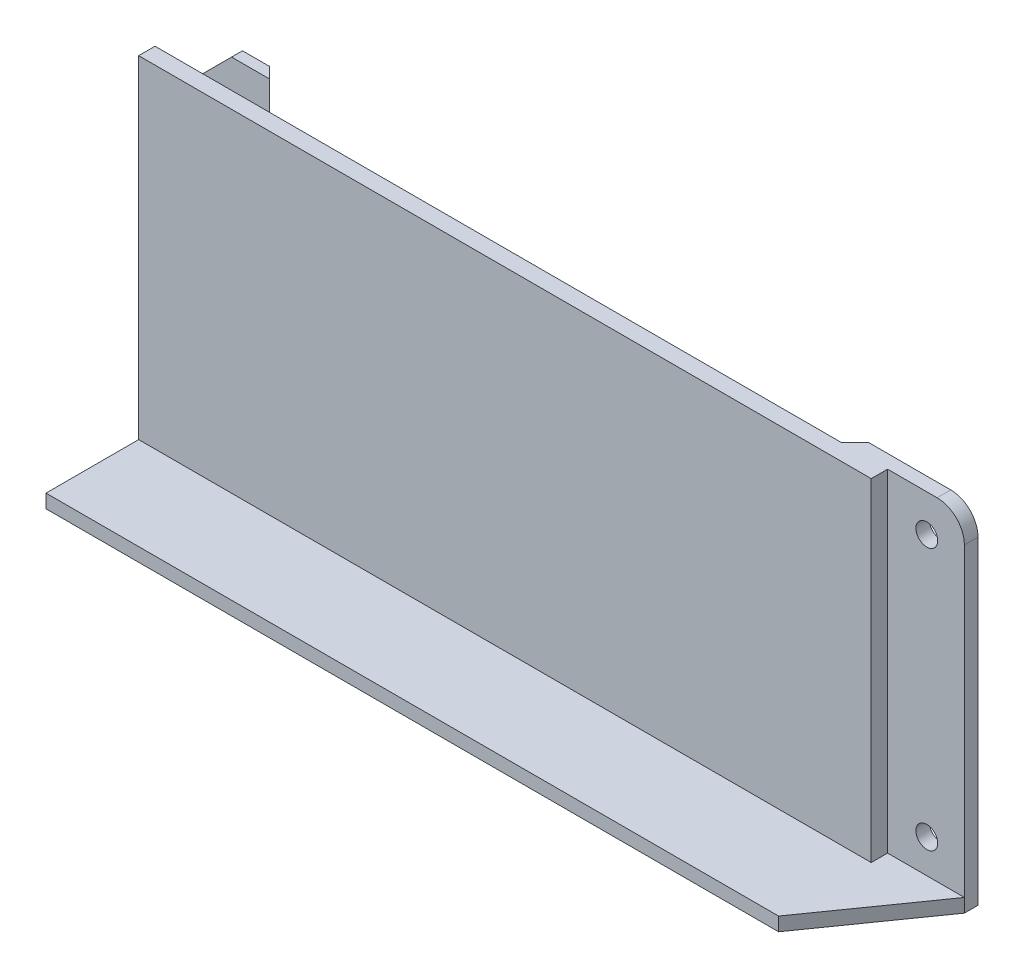
ISO-10303-21;
HEADER;
FILE_DESCRIPTION(('STEP AP214'),'2;1');
FILE_NAME('part.step','',(''),(''),'','','');
FILE_SCHEMA(('AUTOMOTIVE_DESIGN { 1 0 10303 214 1 1 1 1 }'));
ENDSEC;
DATA;
#1=APPLICATION_CONTEXT('core data for automotive mechanical design processes');
#2=APPLICATION_PROTOCOL_DEFINITION('international standard','automotive_design',2000,#1);
#3=PRODUCT_CONTEXT('',#1,'mechanical');
#4=PRODUCT('Part','Part','',(#3));
#5=PRODUCT_RELATED_PRODUCT_CATEGORY('part','',(#4));
#6=PRODUCT_DEFINITION_FORMATION('','',#4);
#7=PRODUCT_DEFINITION_CONTEXT('part definition',#1,'design');
#8=PRODUCT_DEFINITION('design','',#6,#7);
#9=PRODUCT_DEFINITION_SHAPE('','',#8);
#10=(LENGTH_UNIT() NAMED_UNIT(*) SI_UNIT(.MILLI.,.METRE.));
#11=(NAMED_UNIT(*) PLANE_ANGLE_UNIT() SI_UNIT($,.RADIAN.));
#12=(NAMED_UNIT(*) SI_UNIT($,.STERADIAN.) SOLID_ANGLE_UNIT());
#13=UNCERTAINTY_MEASURE_WITH_UNIT(LENGTH_MEASURE(1.E-05),#10,'distance_accuracy_value','');
#14=(GEOMETRIC_REPRESENTATION_CONTEXT(3) GLOBAL_UNCERTAINTY_ASSIGNED_CONTEXT((#13)) GLOBAL_UNIT_ASSIGNED_CONTEXT((#10,
#11,#12)) REPRESENTATION_CONTEXT('',''));
#15=CARTESIAN_POINT('',(0.,0.,0.));
#16=DIRECTION('',(0.,0.,1.));
#17=DIRECTION('',(1.,0.,0.));
#18=AXIS2_PLACEMENT_3D('',#15,#16,#17);
#19=CARTESIAN_POINT('',(480.344700758442,-19.2281954829413,21.));
#20=DIRECTION('',(-0.707106781186541,0.,0.707106781186554));
#21=DIRECTION('',(0.,1.,0.));
#22=AXIS2_PLACEMENT_3D('',#19,#20,#21);
#23=PLANE('',#22);
#24=DIRECTION('',(0.,1.,0.));
#25=VECTOR('',#24,1.);
#26=CARTESIAN_POINT('',(481.344700758442,-22.637593977255,22.));
#27=LINE('',#26,#25);
#28=CARTESIAN_POINT('',(481.344700758442,-22.637593977255,22.));
#29=VERTEX_POINT('',#28);
#30=CARTESIAN_POINT('',(481.344700758442,-14.3,22.));
#31=VERTEX_POINT('',#30);
#32=EDGE_CURVE('E308',#29,#31,#27,.T.);
#33=ORIENTED_EDGE('',*,*,#32,.F.);
#34=DIRECTION('',(0.577350269189632,-0.577350269189623,0.577350269189622));
#35=VECTOR('',#34,1.);
#36=CARTESIAN_POINT('',(479.344700758442,-20.637593977255,20.));
#37=LINE('',#36,#35);
#38=CARTESIAN_POINT('',(479.344700758442,-20.637593977255,20.));
#39=VERTEX_POINT('',#38);
#40=EDGE_CURVE('E11',#39,#29,#37,.T.);
#41=ORIENTED_EDGE('',*,*,#40,.F.);
#42=DIRECTION('',(0.,-1.,0.));
#43=VECTOR('',#42,1.);
#44=CARTESIAN_POINT('',(479.344700758442,-19.2281954829413,20.));
#45=LINE('',#44,#43);
#46=CARTESIAN_POINT('',(479.344700758442,-9.,20.));
#47=VERTEX_POINT('',#46);
#48=EDGE_CURVE('E311',#47,#39,#45,.T.);
#49=ORIENTED_EDGE('',*,*,#48,.F.);
#50=DIRECTION('',(-0.707106781186554,0.,-0.707106781186541));
#51=VECTOR('',#50,1.);
#52=CARTESIAN_POINT('',(480.844700758442,-9.,21.5));
#53=LINE('',#52,#51);
#54=CARTESIAN_POINT('',(481.344700758442,-9.,22.));
#55=VERTEX_POINT('',#54);
#56=EDGE_CURVE('E278',#55,#47,#53,.T.);
#57=ORIENTED_EDGE('',*,*,#56,.F.);
#58=DIRECTION('',(0.,1.,0.));
#59=VECTOR('',#58,1.);
#60=CARTESIAN_POINT('',(481.344700758442,-22.637593977255,22.));
#61=LINE('',#60,#59);
#62=EDGE_CURVE('E220',#31,#55,#61,.T.);
#63=ORIENTED_EDGE('',*,*,#62,.F.);
#64=EDGE_LOOP('',(#33,#41,#49,#57,#63));
#65=FACE_BOUND('',#64,.T.);
#66=ADVANCED_FACE('F17',(#65),#23,.F.);
#67=CARTESIAN_POINT('',(465.8665052755,-21.637593977255,21.));
#68=DIRECTION('',(0.,0.707106781186547,0.707106781186548));
#69=DIRECTION('',(1.,0.,0.));
#70=AXIS2_PLACEMENT_3D('',#67,#68,#69);
#71=PLANE('',#70);
#72=DIRECTION('',(-1.,0.,0.));
#73=VECTOR('',#72,1.);
#74=CARTESIAN_POINT('',(465.8665052755,-20.637593977255,20.));
#75=LINE('',#74,#73);
#76=CARTESIAN_POINT('',(462.707106781187,-20.637593977255,20.));
#77=VERTEX_POINT('',#76);
#78=EDGE_CURVE('E328',#39,#77,#75,.T.);
#79=ORIENTED_EDGE('',*,*,#78,.F.);
#80=ORIENTED_EDGE('',*,*,#40,.T.);
#81=DIRECTION('',(1.,0.,0.));
#82=VECTOR('',#81,1.);
#83=CARTESIAN_POINT('',(460.707106781187,-22.637593977255,22.));
#84=LINE('',#83,#82);
#85=CARTESIAN_POINT('',(460.707106781187,-22.637593977255,22.));
#86=VERTEX_POINT('',#85);
#87=EDGE_CURVE('E189',#86,#29,#84,.T.);
#88=ORIENTED_EDGE('',*,*,#87,.F.);
#89=DIRECTION('',(-0.57735026918962,-0.57735026918963,0.577350269189627));
#90=VECTOR('',#89,1.);
#91=CARTESIAN_POINT('',(466.446204522657,-16.8984962357844,16.2609022585293));
#92=LINE('',#91,#90);
#93=EDGE_CURVE('E27',#77,#86,#92,.T.);
#94=ORIENTED_EDGE('',*,*,#93,.F.);
#95=EDGE_LOOP('',(#79,#80,#88,#94));
#96=FACE_BOUND('',#95,.T.);
#97=ADVANCED_FACE('F613',(#96),#71,.F.);
#98=CARTESIAN_POINT('',(474.344700758442,-9.,22.));
#99=DIRECTION('',(0.707106781186553,-0.707106781186542,0.));
#100=DIRECTION('',(0.,0.,-1.));
#101=AXIS2_PLACEMENT_3D('',#98,#99,#100);
#102=PLANE('',#101);
#103=ORIENTED_EDGE('',*,*,#93,.T.);
#104=DIRECTION('',(-0.707106781186542,-0.707106781186553,0.));
#105=VECTOR('',#104,1.);
#106=CARTESIAN_POINT('',(474.344700758442,-9.,22.));
#107=LINE('',#106,#105);
#108=CARTESIAN_POINT('',(469.044700758442,-14.3,22.));
#109=VERTEX_POINT('',#108);
#110=EDGE_CURVE('E179',#109,#86,#107,.T.);
#111=ORIENTED_EDGE('',*,*,#110,.F.);
#112=DIRECTION('',(-0.707106781186542,-0.707106781186553,0.));
#113=VECTOR('',#112,1.);
#114=CARTESIAN_POINT('',(474.344700758442,-9.,22.));
#115=LINE('',#114,#113);
#116=CARTESIAN_POINT('',(474.344700758442,-9.,22.));
#117=VERTEX_POINT('',#116);
#118=EDGE_CURVE('E184',#117,#109,#115,.T.);
#119=ORIENTED_EDGE('',*,*,#118,.F.);
#120=DIRECTION('',(0.,0.,-1.));
#121=VECTOR('',#120,1.);
#122=CARTESIAN_POINT('',(474.344700758442,-9.,22.));
#123=LINE('',#122,#121);
#124=CARTESIAN_POINT('',(474.344700758442,-9.,20.));
#125=VERTEX_POINT('',#124);
#126=EDGE_CURVE('E295',#117,#125,#123,.T.);
#127=ORIENTED_EDGE('',*,*,#126,.T.);
#128=DIRECTION('',(-0.707106781186542,-0.707106781186553,0.));
#129=VECTOR('',#128,1.);
#130=CARTESIAN_POINT('',(474.344700758442,-9.,20.));
#131=LINE('',#130,#129);
#132=EDGE_CURVE('E315',#125,#77,#131,.T.);
#133=ORIENTED_EDGE('',*,*,#132,.T.);
#134=EDGE_LOOP('',(#103,#111,#119,#127,#133));
#135=FACE_BOUND('',#134,.T.);
#136=ADVANCED_FACE('F181',(#135),#102,.F.);
#137=CARTESIAN_POINT('',(471.025903769814,-15.8187969886275,20.));
#138=DIRECTION('',(0.,0.,1.));
#139=DIRECTION('',(0.,-1.,0.));
#140=AXIS2_PLACEMENT_3D('',#137,#138,#139);
#141=PLANE('',#140);
#142=ORIENTED_EDGE('',*,*,#78,.T.);
#143=ORIENTED_EDGE('',*,*,#132,.F.);
#144=DIRECTION('',(-1.,0.,0.));
#145=VECTOR('',#144,1.);
#146=CARTESIAN_POINT('',(473.637593977255,-9.,20.));
#147=LINE('',#146,#145);
#148=EDGE_CURVE('E291',#47,#125,#147,.T.);
#149=ORIENTED_EDGE('',*,*,#148,.F.);
#150=ORIENTED_EDGE('',*,*,#48,.T.);
#151=EDGE_LOOP('',(#142,#143,#149,#150));
#152=FACE_BOUND('',#151,.T.);
#153=ADVANCED_FACE('F646',(#152),#141,.F.);
#154=CARTESIAN_POINT('',(481.344700758442,-9.,22.));
#155=DIRECTION('',(0.,-1.,0.));
#156=DIRECTION('',(-1.,0.,0.));
#157=AXIS2_PLACEMENT_3D('',#154,#155,#156);
#158=PLANE('',#157);
#159=ORIENTED_EDGE('',*,*,#56,.T.);
#160=ORIENTED_EDGE('',*,*,#148,.T.);
#161=ORIENTED_EDGE('',*,*,#126,.F.);
#162=DIRECTION('',(1.,0.,0.));
#163=VECTOR('',#162,1.);
#164=CARTESIAN_POINT('',(473.637593977255,-9.,22.));
#165=LINE('',#164,#163);
#166=EDGE_CURVE('E20',#117,#55,#165,.T.);
#167=ORIENTED_EDGE('',*,*,#166,.T.);
#168=EDGE_LOOP('',(#159,#160,#161,#167));
#169=FACE_BOUND('',#168,.T.);
#170=ADVANCED_FACE('F626',(#169),#158,.F.);
#171=CARTESIAN_POINT('',(601.742836560724,-46.05,22.));
#172=DIRECTION('',(0.,0.,1.));
#173=DIRECTION('',(0.,-1.,0.));
#174=AXIS2_PLACEMENT_3D('',#171,#172,#173);
#175=PLANE('',#174);
#176=CARTESIAN_POINT('',(601.892836560724,-69.1365481775718,22.));
#177=DIRECTION('',(0.,0.,1.));
#178=DIRECTION('',(1.,0.,0.));
#179=AXIS2_PLACEMENT_3D('',#176,#177,#178);
#180=CIRCLE('',#179,2.);
#181=CARTESIAN_POINT('',(599.892836560724,-69.1365481775718,22.));
#182=VERTEX_POINT('',#181);
#183=EDGE_CURVE('E255',#182,#182,#180,.T.);
#184=ORIENTED_EDGE('',*,*,#183,.F.);
#185=EDGE_LOOP('',(#184));
#186=FACE_BOUND('',#185,.T.);
#187=CARTESIAN_POINT('',(601.892836560724,-21.0770595104522,22.));
#188=DIRECTION('',(0.,0.,1.));
#189=DIRECTION('',(1.,0.,0.));
#190=AXIS2_PLACEMENT_3D('',#187,#188,#189);
#191=CIRCLE('',#190,2.);
#192=CARTESIAN_POINT('',(599.892836560724,-21.0770595104522,22.));
#193=VERTEX_POINT('',#192);
#194=EDGE_CURVE('E332',#193,#193,#191,.T.);
#195=ORIENTED_EDGE('',*,*,#194,.F.);
#196=EDGE_LOOP('',(#195));
#197=FACE_BOUND('',#196,.T.);
#198=CARTESIAN_POINT('',(603.785673121448,-19.3,22.));
#199=DIRECTION('',(0.,0.,1.));
#200=DIRECTION('',(0.707106781186549,0.707106781186546,0.));
#201=AXIS2_PLACEMENT_3D('',#198,#199,#200);
#202=CIRCLE('',#201,5.);
#203=CARTESIAN_POINT('',(608.785673121448,-19.3,22.));
#204=VERTEX_POINT('',#203);
#205=CARTESIAN_POINT('',(603.785673121448,-14.3,22.));
#206=VERTEX_POINT('',#205);
#207=EDGE_CURVE('E256',#204,#206,#202,.T.);
#208=ORIENTED_EDGE('',*,*,#207,.T.);
#209=DIRECTION('',(-1.,0.,0.));
#210=VECTOR('',#209,1.);
#211=CARTESIAN_POINT('',(608.785673121448,-14.3,22.));
#212=LINE('',#211,#210);
#213=CARTESIAN_POINT('',(594.7,-14.3,22.));
#214=VERTEX_POINT('',#213);
#215=EDGE_CURVE('E268',#206,#214,#212,.T.);
#216=ORIENTED_EDGE('',*,*,#215,.T.);
#217=DIRECTION('',(0.,1.,0.));
#218=VECTOR('',#217,1.);
#219=CARTESIAN_POINT('',(594.7,-77.8,22.));
#220=LINE('',#219,#218);
#221=CARTESIAN_POINT('',(594.7,-75.3,22.));
#222=VERTEX_POINT('',#221);
#223=EDGE_CURVE('E251',#222,#214,#220,.T.);
#224=ORIENTED_EDGE('',*,*,#223,.F.);
#225=DIRECTION('',(-1.,0.,0.));
#226=VECTOR('',#225,1.);
#227=CARTESIAN_POINT('',(601.742836560724,-75.3,22.));
#228=LINE('',#227,#226);
#229=CARTESIAN_POINT('',(608.785673121448,-75.3,22.));
#230=VERTEX_POINT('',#229);
#231=EDGE_CURVE('E279',#230,#222,#228,.T.);
#232=ORIENTED_EDGE('',*,*,#231,.F.);
#233=DIRECTION('',(0.,1.,0.));
#234=VECTOR('',#233,1.);
#235=CARTESIAN_POINT('',(608.785673121448,-77.8,22.));
#236=LINE('',#235,#234);
#237=EDGE_CURVE('E250',#230,#204,#236,.T.);
#238=ORIENTED_EDGE('',*,*,#237,.T.);
#239=EDGE_LOOP('',(#208,#216,#224,#232,#238));
#240=FACE_BOUND('',#239,.T.);
#241=ADVANCED_FACE('F583',(#186,#197,#240),#175,.T.);
#242=CARTESIAN_POINT('',(608.785673121448,-77.8,22.));
#243=DIRECTION('',(-1.,0.,0.));
#244=DIRECTION('',(0.,0.,1.));
#245=AXIS2_PLACEMENT_3D('',#242,#243,#244);
#246=PLANE('',#245);
#247=DIRECTION('',(0.,0.,1.));
#248=VECTOR('',#247,1.);
#249=CARTESIAN_POINT('',(608.785673121448,-19.3,22.));
#250=LINE('',#249,#248);
#251=CARTESIAN_POINT('',(608.785673121448,-19.3,19.5));
#252=VERTEX_POINT('',#251);
#253=EDGE_CURVE('E260',#252,#204,#250,.T.);
#254=ORIENTED_EDGE('',*,*,#253,.T.);
#255=ORIENTED_EDGE('',*,*,#237,.F.);
#256=DIRECTION('',(0.,1.,0.));
#257=VECTOR('',#256,1.);
#258=CARTESIAN_POINT('',(608.785673121448,-77.8,22.));
#259=LINE('',#258,#257);
#260=CARTESIAN_POINT('',(608.785673121448,-77.8,22.));
#261=VERTEX_POINT('',#260);
#262=EDGE_CURVE('E246',#261,#230,#259,.T.);
#263=ORIENTED_EDGE('',*,*,#262,.F.);
#264=DIRECTION('',(0.,0.,-1.));
#265=VECTOR('',#264,1.);
#266=CARTESIAN_POINT('',(608.785673121448,-77.8,22.));
#267=LINE('',#266,#265);
#268=CARTESIAN_POINT('',(608.785673121448,-77.8,19.5));
#269=VERTEX_POINT('',#268);
#270=EDGE_CURVE('E244',#261,#269,#267,.T.);
#271=ORIENTED_EDGE('',*,*,#270,.T.);
#272=DIRECTION('',(0.,1.,0.));
#273=VECTOR('',#272,1.);
#274=CARTESIAN_POINT('',(608.785673121448,-77.8,19.5));
#275=LINE('',#274,#273);
#276=EDGE_CURVE('E212',#269,#252,#275,.T.);
#277=ORIENTED_EDGE('',*,*,#276,.T.);
#278=EDGE_LOOP('',(#254,#255,#263,#271,#277));
#279=FACE_BOUND('',#278,.T.);
#280=ADVANCED_FACE('F578',(#279),#246,.F.);
#281=CARTESIAN_POINT('',(608.785673121448,-77.8,22.));
#282=DIRECTION('',(-0.817583198432766,0.,-0.575810484135578));
#283=DIRECTION('',(-0.575810484135578,0.,0.817583198432766));
#284=AXIS2_PLACEMENT_3D('',#281,#282,#283);
#285=PLANE('',#284);
#286=DIRECTION('',(-0.575810484135578,0.,0.817583198432766));
#287=VECTOR('',#286,1.);
#288=CARTESIAN_POINT('',(608.785673121448,-77.8,22.));
#289=LINE('',#288,#287);
#290=CARTESIAN_POINT('',(594.7,-77.8,42.));
#291=VERTEX_POINT('',#290);
#292=EDGE_CURVE('E240',#261,#291,#289,.T.);
#293=ORIENTED_EDGE('',*,*,#292,.F.);
#294=ORIENTED_EDGE('',*,*,#262,.T.);
#295=DIRECTION('',(-0.575810484135578,0.,0.817583198432766));
#296=VECTOR('',#295,1.);
#297=CARTESIAN_POINT('',(608.785673121448,-75.3,22.));
#298=LINE('',#297,#296);
#299=CARTESIAN_POINT('',(594.7,-75.3,42.));
#300=VERTEX_POINT('',#299);
#301=EDGE_CURVE('E283',#230,#300,#298,.T.);
#302=ORIENTED_EDGE('',*,*,#301,.T.);
#303=DIRECTION('',(0.,-1.,0.));
#304=VECTOR('',#303,1.);
#305=CARTESIAN_POINT('',(594.7,-61.925,42.0000000000007));
#306=LINE('',#305,#304);
#307=EDGE_CURVE('E300',#300,#291,#306,.T.);
#308=ORIENTED_EDGE('',*,*,#307,.T.);
#309=EDGE_LOOP('',(#293,#294,#302,#308));
#310=FACE_BOUND('',#309,.T.);
#311=ADVANCED_FACE('F573',(#310),#285,.F.);
#312=CARTESIAN_POINT('',(587.45,-14.3,20.75));
#313=DIRECTION('',(0.707106781186563,0.,0.707106781186532));
#314=DIRECTION('',(0.,-1.,0.));
#315=AXIS2_PLACEMENT_3D('',#312,#313,#314);
#316=PLANE('',#315);
#317=DIRECTION('',(0.707106781186532,0.,-0.707106781186563));
#318=VECTOR('',#317,1.);
#319=CARTESIAN_POINT('',(588.95,-77.8,19.25));
#320=LINE('',#319,#318);
#321=CARTESIAN_POINT('',(586.2,-77.8,22.));
#322=VERTEX_POINT('',#321);
#323=CARTESIAN_POINT('',(588.7,-77.8,19.5));
#324=VERTEX_POINT('',#323);
#325=EDGE_CURVE('E165',#322,#324,#320,.T.);
#326=ORIENTED_EDGE('',*,*,#325,.F.);
#327=DIRECTION('',(0.,-1.,0.));
#328=VECTOR('',#327,1.);
#329=CARTESIAN_POINT('',(586.2,-14.3,22.));
#330=LINE('',#329,#328);
#331=CARTESIAN_POINT('',(586.2,-14.3,22.));
#332=VERTEX_POINT('',#331);
#333=EDGE_CURVE('E307',#332,#322,#330,.T.);
#334=ORIENTED_EDGE('',*,*,#333,.F.);
#335=DIRECTION('',(-0.707106781186532,0.,0.707106781186563));
#336=VECTOR('',#335,1.);
#337=CARTESIAN_POINT('',(592.471418280362,-14.3,15.7285817196381));
#338=LINE('',#337,#336);
#339=CARTESIAN_POINT('',(588.7,-14.3,19.5));
#340=VERTEX_POINT('',#339);
#341=EDGE_CURVE('E150',#340,#332,#338,.T.);
#342=ORIENTED_EDGE('',*,*,#341,.F.);
#343=DIRECTION('',(0.,1.,0.));
#344=VECTOR('',#343,1.);
#345=CARTESIAN_POINT('',(588.7,-77.8,19.5));
#346=LINE('',#345,#344);
#347=EDGE_CURVE('E265',#324,#340,#346,.T.);
#348=ORIENTED_EDGE('',*,*,#347,.F.);
#349=EDGE_LOOP('',(#326,#334,#342,#348));
#350=FACE_BOUND('',#349,.T.);
#351=ADVANCED_FACE('F568',(#350),#316,.F.);
#352=CARTESIAN_POINT('',(594.7,-46.05,32.));
#353=DIRECTION('',(1.,0.,0.));
#354=DIRECTION('',(0.,1.,0.));
#355=AXIS2_PLACEMENT_3D('',#352,#353,#354);
#356=PLANE('',#355);
#357=DIRECTION('',(0.,0.,1.));
#358=VECTOR('',#357,1.);
#359=CARTESIAN_POINT('',(594.7,-75.3,32.));
#360=LINE('',#359,#358);
#361=CARTESIAN_POINT('',(594.7,-75.3,25.));
#362=VERTEX_POINT('',#361);
#363=EDGE_CURVE('E282',#222,#362,#360,.T.);
#364=ORIENTED_EDGE('',*,*,#363,.F.);
#365=ORIENTED_EDGE('',*,*,#223,.T.);
#366=DIRECTION('',(0.,0.,1.));
#367=VECTOR('',#366,1.);
#368=CARTESIAN_POINT('',(594.7,-14.3,28.5));
#369=LINE('',#368,#367);
#370=CARTESIAN_POINT('',(594.7,-14.3,25.));
#371=VERTEX_POINT('',#370);
#372=EDGE_CURVE('E233',#214,#371,#369,.T.);
#373=ORIENTED_EDGE('',*,*,#372,.T.);
#374=DIRECTION('',(0.,-1.,0.));
#375=VECTOR('',#374,1.);
#376=CARTESIAN_POINT('',(594.7,-60.675,25.));
#377=LINE('',#376,#375);
#378=EDGE_CURVE('E190',#371,#362,#377,.T.);
#379=ORIENTED_EDGE('',*,*,#378,.T.);
#380=EDGE_LOOP('',(#364,#365,#373,#379));
#381=FACE_BOUND('',#380,.T.);
#382=ADVANCED_FACE('F562',(#381),#356,.T.);
#383=CARTESIAN_POINT('',(460.,-14.3,22.));
#384=DIRECTION('',(0.,0.,1.));
#385=DIRECTION('',(0.,-1.,0.));
#386=AXIS2_PLACEMENT_3D('',#383,#384,#385);
#387=PLANE('',#386);
#388=ORIENTED_EDGE('',*,*,#110,.T.);
#389=ORIENTED_EDGE('',*,*,#87,.T.);
#390=ORIENTED_EDGE('',*,*,#32,.T.);
#391=DIRECTION('',(1.,0.,0.));
#392=VECTOR('',#391,1.);
#393=CARTESIAN_POINT('',(460.,-14.3,22.));
#394=LINE('',#393,#392);
#395=EDGE_CURVE('E203',#31,#332,#394,.T.);
#396=ORIENTED_EDGE('',*,*,#395,.T.);
#397=ORIENTED_EDGE('',*,*,#333,.T.);
#398=DIRECTION('',(1.,0.,0.));
#399=VECTOR('',#398,1.);
#400=CARTESIAN_POINT('',(460.,-77.8,22.));
#401=LINE('',#400,#399);
#402=CARTESIAN_POINT('',(460.3,-77.8,22.));
#403=VERTEX_POINT('',#402);
#404=EDGE_CURVE('E237',#403,#322,#401,.T.);
#405=ORIENTED_EDGE('',*,*,#404,.F.);
#406=DIRECTION('',(0.,1.,0.));
#407=VECTOR('',#406,1.);
#408=CARTESIAN_POINT('',(460.3,-30.175,22.));
#409=LINE('',#408,#407);
#410=CARTESIAN_POINT('',(460.3,-14.3,22.));
#411=VERTEX_POINT('',#410);
#412=EDGE_CURVE('E196',#403,#411,#409,.T.);
#413=ORIENTED_EDGE('',*,*,#412,.T.);
#414=DIRECTION('',(1.,0.,0.));
#415=VECTOR('',#414,1.);
#416=CARTESIAN_POINT('',(460.,-14.3,22.));
#417=LINE('',#416,#415);
#418=EDGE_CURVE('E193',#411,#109,#417,.T.);
#419=ORIENTED_EDGE('',*,*,#418,.T.);
#420=EDGE_LOOP('',(#388,#389,#390,#396,#397,#405,#413,#419));
#421=FACE_BOUND('',#420,.T.);
#422=ADVANCED_FACE('F194',(#421),#387,.F.);
#423=CARTESIAN_POINT('',(460.,-75.3,25.));
#424=DIRECTION('',(0.,0.,-1.));
#425=DIRECTION('',(0.,-1.,0.));
#426=AXIS2_PLACEMENT_3D('',#423,#424,#425);
#427=PLANE('',#426);
#428=ORIENTED_EDGE('',*,*,#378,.F.);
#429=DIRECTION('',(1.,0.,0.));
#430=VECTOR('',#429,1.);
#431=CARTESIAN_POINT('',(460.,-14.3,25.));
#432=LINE('',#431,#430);
#433=CARTESIAN_POINT('',(460.3,-14.3,25.));
#434=VERTEX_POINT('',#433);
#435=EDGE_CURVE('E349',#434,#371,#432,.T.);
#436=ORIENTED_EDGE('',*,*,#435,.F.);
#437=DIRECTION('',(0.,-1.,0.));
#438=VECTOR('',#437,1.);
#439=CARTESIAN_POINT('',(460.3,-60.675,25.));
#440=LINE('',#439,#438);
#441=CARTESIAN_POINT('',(460.3,-75.3,25.));
#442=VERTEX_POINT('',#441);
#443=EDGE_CURVE('E340',#434,#442,#440,.T.);
#444=ORIENTED_EDGE('',*,*,#443,.T.);
#445=DIRECTION('',(1.,0.,0.));
#446=VECTOR('',#445,1.);
#447=CARTESIAN_POINT('',(460.,-75.3,25.));
#448=LINE('',#447,#446);
#449=EDGE_CURVE('E322',#442,#362,#448,.T.);
#450=ORIENTED_EDGE('',*,*,#449,.T.);
#451=EDGE_LOOP('',(#428,#436,#444,#450));
#452=FACE_BOUND('',#451,.T.);
#453=ADVANCED_FACE('F561',(#452),#427,.F.);
#454=CARTESIAN_POINT('',(460.,-75.3,42.));
#455=DIRECTION('',(0.,-1.,0.));
#456=DIRECTION('',(-1.,0.,0.));
#457=AXIS2_PLACEMENT_3D('',#454,#455,#456);
#458=PLANE('',#457);
#459=DIRECTION('',(1.,0.,0.));
#460=VECTOR('',#459,1.);
#461=CARTESIAN_POINT('',(460.,-75.3,42.));
#462=LINE('',#461,#460);
#463=CARTESIAN_POINT('',(460.3,-75.3,42.));
#464=VERTEX_POINT('',#463);
#465=EDGE_CURVE('E296',#464,#300,#462,.T.);
#466=ORIENTED_EDGE('',*,*,#465,.T.);
#467=ORIENTED_EDGE('',*,*,#301,.F.);
#468=ORIENTED_EDGE('',*,*,#231,.T.);
#469=ORIENTED_EDGE('',*,*,#363,.T.);
#470=ORIENTED_EDGE('',*,*,#449,.F.);
#471=DIRECTION('',(0.,0.,1.));
#472=VECTOR('',#471,1.);
#473=CARTESIAN_POINT('',(460.3,-75.3,37.));
#474=LINE('',#473,#472);
#475=EDGE_CURVE('E336',#442,#464,#474,.T.);
#476=ORIENTED_EDGE('',*,*,#475,.T.);
#477=EDGE_LOOP('',(#466,#467,#468,#469,#470,#476));
#478=FACE_BOUND('',#477,.T.);
#479=ADVANCED_FACE('F592',(#478),#458,.F.);
#480=CARTESIAN_POINT('',(460.,-77.8,42.));
#481=DIRECTION('',(0.,0.,-1.));
#482=DIRECTION('',(-1.,0.,0.));
#483=AXIS2_PLACEMENT_3D('',#480,#481,#482);
#484=PLANE('',#483);
#485=ORIENTED_EDGE('',*,*,#307,.F.);
#486=ORIENTED_EDGE('',*,*,#465,.F.);
#487=DIRECTION('',(0.,-1.,0.));
#488=VECTOR('',#487,1.);
#489=CARTESIAN_POINT('',(460.3,-61.925,42.0000000000007));
#490=LINE('',#489,#488);
#491=CARTESIAN_POINT('',(460.3,-77.8,42.));
#492=VERTEX_POINT('',#491);
#493=EDGE_CURVE('E341',#464,#492,#490,.T.);
#494=ORIENTED_EDGE('',*,*,#493,.T.);
#495=DIRECTION('',(1.,0.,0.));
#496=VECTOR('',#495,1.);
#497=CARTESIAN_POINT('',(460.,-77.8,42.));
#498=LINE('',#497,#496);
#499=EDGE_CURVE('E243',#492,#291,#498,.T.);
#500=ORIENTED_EDGE('',*,*,#499,.T.);
#501=EDGE_LOOP('',(#485,#486,#494,#500));
#502=FACE_BOUND('',#501,.T.);
#503=ADVANCED_FACE('F674',(#502),#484,.F.);
#504=CARTESIAN_POINT('',(460.3,-46.05,32.));
#505=DIRECTION('',(-1.,0.,0.));
#506=DIRECTION('',(0.,0.,1.));
#507=AXIS2_PLACEMENT_3D('',#504,#505,#506);
#508=PLANE('',#507);
#509=DIRECTION('',(0.,0.,1.));
#510=VECTOR('',#509,1.);
#511=CARTESIAN_POINT('',(460.3,-14.3,28.5));
#512=LINE('',#511,#510);
#513=EDGE_CURVE('E202',#411,#434,#512,.T.);
#514=ORIENTED_EDGE('',*,*,#513,.F.);
#515=ORIENTED_EDGE('',*,*,#412,.F.);
#516=DIRECTION('',(0.,0.,-1.));
#517=VECTOR('',#516,1.);
#518=CARTESIAN_POINT('',(460.3,-77.8,27.));
#519=LINE('',#518,#517);
#520=EDGE_CURVE('E274',#492,#403,#519,.T.);
#521=ORIENTED_EDGE('',*,*,#520,.F.);
#522=ORIENTED_EDGE('',*,*,#493,.F.);
#523=ORIENTED_EDGE('',*,*,#475,.F.);
#524=ORIENTED_EDGE('',*,*,#443,.F.);
#525=EDGE_LOOP('',(#514,#515,#521,#522,#523,#524));
#526=FACE_BOUND('',#525,.T.);
#527=ADVANCED_FACE('F637',(#526),#508,.T.);
#528=CARTESIAN_POINT('',(608.785673121448,-14.3,22.));
#529=DIRECTION('',(0.,-1.,0.));
#530=DIRECTION('',(0.,0.,-1.));
#531=AXIS2_PLACEMENT_3D('',#528,#529,#530);
#532=PLANE('',#531);
#533=DIRECTION('',(0.,0.,-1.));
#534=VECTOR('',#533,1.);
#535=CARTESIAN_POINT('',(603.785673121448,-14.3,22.));
#536=LINE('',#535,#534);
#537=CARTESIAN_POINT('',(603.785673121448,-14.3,19.5));
#538=VERTEX_POINT('',#537);
#539=EDGE_CURVE('E261',#206,#538,#536,.T.);
#540=ORIENTED_EDGE('',*,*,#539,.T.);
#541=DIRECTION('',(-1.,0.,0.));
#542=VECTOR('',#541,1.);
#543=CARTESIAN_POINT('',(608.785673121448,-14.3,19.5));
#544=LINE('',#543,#542);
#545=EDGE_CURVE('E262',#538,#340,#544,.T.);
#546=ORIENTED_EDGE('',*,*,#545,.T.);
#547=ORIENTED_EDGE('',*,*,#341,.T.);
#548=ORIENTED_EDGE('',*,*,#395,.F.);
#549=DIRECTION('',(-1.,0.,0.));
#550=VECTOR('',#549,1.);
#551=CARTESIAN_POINT('',(539.905788445631,-14.3,22.));
#552=LINE('',#551,#550);
#553=EDGE_CURVE('E209',#31,#109,#552,.T.);
#554=ORIENTED_EDGE('',*,*,#553,.T.);
#555=ORIENTED_EDGE('',*,*,#418,.F.);
#556=ORIENTED_EDGE('',*,*,#513,.T.);
#557=ORIENTED_EDGE('',*,*,#435,.T.);
#558=ORIENTED_EDGE('',*,*,#372,.F.);
#559=ORIENTED_EDGE('',*,*,#215,.F.);
#560=EDGE_LOOP('',(#540,#546,#547,#548,#554,#555,#556,#557,#558,#559));
#561=FACE_BOUND('',#560,.T.);
#562=ADVANCED_FACE('F216',(#561),#532,.F.);
#563=CARTESIAN_POINT('',(594.7,-77.8,22.));
#564=DIRECTION('',(0.,1.,0.));
#565=DIRECTION('',(1.,0.,0.));
#566=AXIS2_PLACEMENT_3D('',#563,#564,#565);
#567=PLANE('',#566);
#568=ORIENTED_EDGE('',*,*,#270,.F.);
#569=ORIENTED_EDGE('',*,*,#292,.T.);
#570=ORIENTED_EDGE('',*,*,#499,.F.);
#571=ORIENTED_EDGE('',*,*,#520,.T.);
#572=ORIENTED_EDGE('',*,*,#404,.T.);
#573=ORIENTED_EDGE('',*,*,#325,.T.);
#574=DIRECTION('',(-1.,0.,0.));
#575=VECTOR('',#574,1.);
#576=CARTESIAN_POINT('',(594.7,-77.8,19.5));
#577=LINE('',#576,#575);
#578=EDGE_CURVE('E366',#269,#324,#577,.T.);
#579=ORIENTED_EDGE('',*,*,#578,.F.);
#580=EDGE_LOOP('',(#568,#569,#570,#571,#572,#573,#579));
#581=FACE_BOUND('',#580,.T.);
#582=ADVANCED_FACE('F636',(#581),#567,.F.);
#583=CARTESIAN_POINT('',(601.742836560724,-46.05,19.5));
#584=DIRECTION('',(0.,0.,1.));
#585=DIRECTION('',(1.,0.,0.));
#586=AXIS2_PLACEMENT_3D('',#583,#584,#585);
#587=PLANE('',#586);
#588=CARTESIAN_POINT('',(601.892836560724,-21.0770595104522,19.5));
#589=DIRECTION('',(0.,0.,-1.));
#590=DIRECTION('',(1.,0.,0.));
#591=AXIS2_PLACEMENT_3D('',#588,#589,#590);
#592=CIRCLE('',#591,2.);
#593=CARTESIAN_POINT('',(599.892836560724,-21.0770595104522,19.5));
#594=VERTEX_POINT('',#593);
#595=EDGE_CURVE('E304',#594,#594,#592,.T.);
#596=ORIENTED_EDGE('',*,*,#595,.F.);
#597=EDGE_LOOP('',(#596));
#598=FACE_BOUND('',#597,.T.);
#599=CARTESIAN_POINT('',(601.892836560724,-69.1365481775718,19.5));
#600=DIRECTION('',(0.,0.,-1.));
#601=DIRECTION('',(1.,0.,0.));
#602=AXIS2_PLACEMENT_3D('',#599,#600,#601);
#603=CIRCLE('',#602,2.);
#604=CARTESIAN_POINT('',(599.892836560724,-69.1365481775718,19.5));
#605=VERTEX_POINT('',#604);
#606=EDGE_CURVE('E221',#605,#605,#603,.T.);
#607=ORIENTED_EDGE('',*,*,#606,.F.);
#608=EDGE_LOOP('',(#607));
#609=FACE_BOUND('',#608,.T.);
#610=CARTESIAN_POINT('',(603.785673121448,-19.3,19.5));
#611=DIRECTION('',(0.,0.,-1.));
#612=DIRECTION('',(0.707106781186549,0.707106781186546,0.));
#613=AXIS2_PLACEMENT_3D('',#610,#611,#612);
#614=CIRCLE('',#613,5.);
#615=EDGE_CURVE('E287',#538,#252,#614,.T.);
#616=ORIENTED_EDGE('',*,*,#615,.T.);
#617=ORIENTED_EDGE('',*,*,#276,.F.);
#618=ORIENTED_EDGE('',*,*,#578,.T.);
#619=ORIENTED_EDGE('',*,*,#347,.T.);
#620=ORIENTED_EDGE('',*,*,#545,.F.);
#621=EDGE_LOOP('',(#616,#617,#618,#619,#620));
#622=FACE_BOUND('',#621,.T.);
#623=ADVANCED_FACE('F665',(#598,#609,#622),#587,.F.);
#624=CARTESIAN_POINT('',(471.025903769814,-15.8187969886275,22.));
#625=DIRECTION('',(0.,0.,1.));
#626=DIRECTION('',(0.,-1.,0.));
#627=AXIS2_PLACEMENT_3D('',#624,#625,#626);
#628=PLANE('',#627);
#629=ORIENTED_EDGE('',*,*,#553,.F.);
#630=ORIENTED_EDGE('',*,*,#62,.T.);
#631=ORIENTED_EDGE('',*,*,#166,.F.);
#632=ORIENTED_EDGE('',*,*,#118,.T.);
#633=EDGE_LOOP('',(#629,#630,#631,#632));
#634=FACE_BOUND('',#633,.T.);
#635=ADVANCED_FACE('F207',(#634),#628,.T.);
#636=CARTESIAN_POINT('',(601.892836560724,-69.1365481775718,19.5));
#637=DIRECTION('',(0.,0.,-1.));
#638=DIRECTION('',(1.,0.,0.));
#639=AXIS2_PLACEMENT_3D('',#636,#637,#638);
#640=CYLINDRICAL_SURFACE('',#639,2.);
#641=ORIENTED_EDGE('',*,*,#183,.T.);
#642=DIRECTION('',(0.,0.,-1.));
#643=VECTOR('',#642,1.);
#644=CARTESIAN_POINT('',(599.892836560724,-69.1365481775718,19.5));
#645=LINE('',#644,#643);
#646=EDGE_CURVE('E229',#182,#605,#645,.T.);
#647=ORIENTED_EDGE('',*,*,#646,.T.);
#648=ORIENTED_EDGE('',*,*,#606,.T.);
#649=ORIENTED_EDGE('',*,*,#646,.F.);
#650=EDGE_LOOP('',(#641,#647,#648,#649));
#651=FACE_BOUND('',#650,.T.);
#652=ADVANCED_FACE('F545',(#651),#640,.F.);
#653=CARTESIAN_POINT('',(601.892836560724,-21.0770595104522,19.5));
#654=DIRECTION('',(0.,0.,-1.));
#655=DIRECTION('',(1.,0.,0.));
#656=AXIS2_PLACEMENT_3D('',#653,#654,#655);
#657=CYLINDRICAL_SURFACE('',#656,2.);
#658=ORIENTED_EDGE('',*,*,#194,.T.);
#659=DIRECTION('',(0.,0.,-1.));
#660=VECTOR('',#659,1.);
#661=CARTESIAN_POINT('',(599.892836560724,-21.0770595104522,19.5));
#662=LINE('',#661,#660);
#663=EDGE_CURVE('E318',#193,#594,#662,.T.);
#664=ORIENTED_EDGE('',*,*,#663,.T.);
#665=ORIENTED_EDGE('',*,*,#595,.T.);
#666=ORIENTED_EDGE('',*,*,#663,.F.);
#667=EDGE_LOOP('',(#658,#664,#665,#666));
#668=FACE_BOUND('',#667,.T.);
#669=ADVANCED_FACE('F550',(#668),#657,.F.);
#670=CARTESIAN_POINT('',(603.785673121448,-19.3,22.));
#671=DIRECTION('',(0.,0.,1.));
#672=DIRECTION('',(0.707106781186549,0.707106781186546,0.));
#673=AXIS2_PLACEMENT_3D('',#670,#671,#672);
#674=CYLINDRICAL_SURFACE('',#673,5.);
#675=ORIENTED_EDGE('',*,*,#615,.F.);
#676=ORIENTED_EDGE('',*,*,#539,.F.);
#677=ORIENTED_EDGE('',*,*,#207,.F.);
#678=ORIENTED_EDGE('',*,*,#253,.F.);
#679=EDGE_LOOP('',(#675,#676,#677,#678));
#680=FACE_BOUND('',#679,.T.);
#681=ADVANCED_FACE('F598',(#680),#674,.T.);
#682=CLOSED_SHELL('',(#66,#97,#136,#153,#170,#241,#280,#311,#351,#382,#422,#453,#479,#503,#527,
#562,#582,#623,#635,#652,#669,#681));
#683=MANIFOLD_SOLID_BREP('B1',#682);
#684=ADVANCED_BREP_SHAPE_REPRESENTATION('',(#18,#683),#14);
#685=SHAPE_DEFINITION_REPRESENTATION(#9,#684);
ENDSEC;
END-ISO-10303-21;
